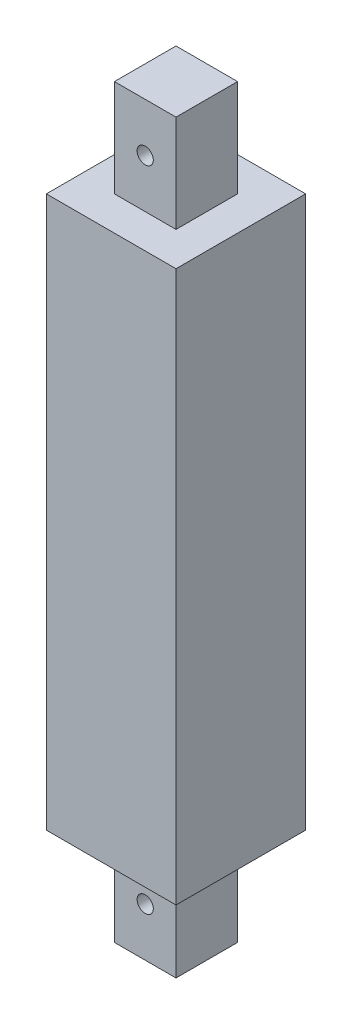
ISO-10303-21;
HEADER;
FILE_DESCRIPTION(('STEP AP214'),'2;1');
FILE_NAME('part.step','',(''),(''),'','','');
FILE_SCHEMA(('AUTOMOTIVE_DESIGN { 1 0 10303 214 1 1 1 1 }'));
ENDSEC;
DATA;
#1=APPLICATION_CONTEXT('core data for automotive mechanical design processes');
#2=APPLICATION_PROTOCOL_DEFINITION('international standard','automotive_design',2000,#1);
#3=PRODUCT_CONTEXT('',#1,'mechanical');
#4=PRODUCT('Part','Part','',(#3));
#5=PRODUCT_RELATED_PRODUCT_CATEGORY('part','',(#4));
#6=PRODUCT_DEFINITION_FORMATION('','',#4);
#7=PRODUCT_DEFINITION_CONTEXT('part definition',#1,'design');
#8=PRODUCT_DEFINITION('design','',#6,#7);
#9=PRODUCT_DEFINITION_SHAPE('','',#8);
#10=(LENGTH_UNIT() NAMED_UNIT(*) SI_UNIT(.MILLI.,.METRE.));
#11=(NAMED_UNIT(*) PLANE_ANGLE_UNIT() SI_UNIT($,.RADIAN.));
#12=(NAMED_UNIT(*) SI_UNIT($,.STERADIAN.) SOLID_ANGLE_UNIT());
#13=UNCERTAINTY_MEASURE_WITH_UNIT(LENGTH_MEASURE(1.E-05),#10,'distance_accuracy_value','');
#14=(GEOMETRIC_REPRESENTATION_CONTEXT(3) GLOBAL_UNCERTAINTY_ASSIGNED_CONTEXT((#13)) GLOBAL_UNIT_ASSIGNED_CONTEXT((#10,
#11,#12)) REPRESENTATION_CONTEXT('',''));
#15=CARTESIAN_POINT('',(0.,0.,0.));
#16=DIRECTION('',(0.,0.,1.));
#17=DIRECTION('',(1.,0.,0.));
#18=AXIS2_PLACEMENT_3D('',#15,#16,#17);
#19=CARTESIAN_POINT('',(0.,0.,0.));
#20=DIRECTION('',(0.,1.,0.));
#21=DIRECTION('',(0.,0.,1.));
#22=AXIS2_PLACEMENT_3D('',#19,#20,#21);
#23=PLANE('',#22);
#24=DIRECTION('',(0.,0.,-1.));
#25=VECTOR('',#24,1.);
#26=CARTESIAN_POINT('',(20.,0.,-20.));
#27=LINE('',#26,#25);
#28=CARTESIAN_POINT('',(20.,0.,20.));
#29=VERTEX_POINT('',#28);
#30=CARTESIAN_POINT('',(20.,0.,-20.));
#31=VERTEX_POINT('',#30);
#32=EDGE_CURVE('E209',#29,#31,#27,.T.);
#33=ORIENTED_EDGE('',*,*,#32,.F.);
#34=DIRECTION('',(1.,0.,0.));
#35=VECTOR('',#34,1.);
#36=CARTESIAN_POINT('',(-20.,0.,20.));
#37=LINE('',#36,#35);
#38=CARTESIAN_POINT('',(-20.,0.,20.));
#39=VERTEX_POINT('',#38);
#40=EDGE_CURVE('E215',#39,#29,#37,.T.);
#41=ORIENTED_EDGE('',*,*,#40,.F.);
#42=DIRECTION('',(0.,0.,1.));
#43=VECTOR('',#42,1.);
#44=CARTESIAN_POINT('',(-20.,0.,-20.));
#45=LINE('',#44,#43);
#46=CARTESIAN_POINT('',(-20.,0.,-20.));
#47=VERTEX_POINT('',#46);
#48=EDGE_CURVE('E231',#47,#39,#45,.T.);
#49=ORIENTED_EDGE('',*,*,#48,.F.);
#50=DIRECTION('',(-1.,0.,0.));
#51=VECTOR('',#50,1.);
#52=CARTESIAN_POINT('',(-20.,0.,-20.));
#53=LINE('',#52,#51);
#54=EDGE_CURVE('E228',#31,#47,#53,.T.);
#55=ORIENTED_EDGE('',*,*,#54,.F.);
#56=EDGE_LOOP('',(#33,#41,#49,#55));
#57=FACE_BOUND('',#56,.T.);
#58=DIRECTION('',(0.,0.,1.));
#59=VECTOR('',#58,1.);
#60=CARTESIAN_POINT('',(9.5,0.,9.5));
#61=LINE('',#60,#59);
#62=CARTESIAN_POINT('',(9.5,0.,-9.5));
#63=VERTEX_POINT('',#62);
#64=CARTESIAN_POINT('',(9.5,0.,9.5));
#65=VERTEX_POINT('',#64);
#66=EDGE_CURVE('E61',#63,#65,#61,.T.);
#67=ORIENTED_EDGE('',*,*,#66,.F.);
#68=DIRECTION('',(1.,0.,0.));
#69=VECTOR('',#68,1.);
#70=CARTESIAN_POINT('',(-9.5,0.,-9.5));
#71=LINE('',#70,#69);
#72=CARTESIAN_POINT('',(-9.5,0.,-9.5));
#73=VERTEX_POINT('',#72);
#74=EDGE_CURVE('E65',#73,#63,#71,.T.);
#75=ORIENTED_EDGE('',*,*,#74,.F.);
#76=DIRECTION('',(0.,0.,-1.));
#77=VECTOR('',#76,1.);
#78=CARTESIAN_POINT('',(-9.5,0.,9.5));
#79=LINE('',#78,#77);
#80=CARTESIAN_POINT('',(-9.5,0.,9.5));
#81=VERTEX_POINT('',#80);
#82=EDGE_CURVE('E370',#81,#73,#79,.T.);
#83=ORIENTED_EDGE('',*,*,#82,.F.);
#84=DIRECTION('',(-1.,0.,0.));
#85=VECTOR('',#84,1.);
#86=CARTESIAN_POINT('',(-9.5,0.,9.5));
#87=LINE('',#86,#85);
#88=EDGE_CURVE('E367',#65,#81,#87,.T.);
#89=ORIENTED_EDGE('',*,*,#88,.F.);
#90=EDGE_LOOP('',(#67,#75,#83,#89));
#91=FACE_BOUND('',#90,.T.);
#92=ADVANCED_FACE('F45',(#57,#91),#23,.F.);
#93=CARTESIAN_POINT('',(20.,170.,-20.));
#94=DIRECTION('',(-1.,0.,0.));
#95=DIRECTION('',(0.,0.,1.));
#96=AXIS2_PLACEMENT_3D('',#93,#94,#95);
#97=PLANE('',#96);
#98=ORIENTED_EDGE('',*,*,#32,.T.);
#99=DIRECTION('',(0.,-1.,0.));
#100=VECTOR('',#99,1.);
#101=CARTESIAN_POINT('',(20.,170.,-20.));
#102=LINE('',#101,#100);
#103=CARTESIAN_POINT('',(20.,170.,-20.));
#104=VERTEX_POINT('',#103);
#105=EDGE_CURVE('E11',#104,#31,#102,.T.);
#106=ORIENTED_EDGE('',*,*,#105,.F.);
#107=DIRECTION('',(0.,0.,-1.));
#108=VECTOR('',#107,1.);
#109=CARTESIAN_POINT('',(20.,170.,-20.));
#110=LINE('',#109,#108);
#111=CARTESIAN_POINT('',(20.,170.,20.));
#112=VERTEX_POINT('',#111);
#113=EDGE_CURVE('E210',#112,#104,#110,.T.);
#114=ORIENTED_EDGE('',*,*,#113,.F.);
#115=DIRECTION('',(0.,-1.,0.));
#116=VECTOR('',#115,1.);
#117=CARTESIAN_POINT('',(20.,170.,20.));
#118=LINE('',#117,#116);
#119=EDGE_CURVE('E224',#112,#29,#118,.T.);
#120=ORIENTED_EDGE('',*,*,#119,.T.);
#121=EDGE_LOOP('',(#98,#106,#114,#120));
#122=FACE_BOUND('',#121,.T.);
#123=ADVANCED_FACE('F47',(#122),#97,.F.);
#124=CARTESIAN_POINT('',(-20.,170.,-20.));
#125=DIRECTION('',(0.,0.,1.));
#126=DIRECTION('',(1.,0.,0.));
#127=AXIS2_PLACEMENT_3D('',#124,#125,#126);
#128=PLANE('',#127);
#129=ORIENTED_EDGE('',*,*,#54,.T.);
#130=DIRECTION('',(0.,-1.,0.));
#131=VECTOR('',#130,1.);
#132=CARTESIAN_POINT('',(-20.,170.,-20.));
#133=LINE('',#132,#131);
#134=CARTESIAN_POINT('',(-20.,170.,-20.));
#135=VERTEX_POINT('',#134);
#136=EDGE_CURVE('E54',#135,#47,#133,.T.);
#137=ORIENTED_EDGE('',*,*,#136,.F.);
#138=DIRECTION('',(-1.,0.,0.));
#139=VECTOR('',#138,1.);
#140=CARTESIAN_POINT('',(-20.,170.,-20.));
#141=LINE('',#140,#139);
#142=EDGE_CURVE('E214',#104,#135,#141,.T.);
#143=ORIENTED_EDGE('',*,*,#142,.F.);
#144=ORIENTED_EDGE('',*,*,#105,.T.);
#145=EDGE_LOOP('',(#129,#137,#143,#144));
#146=FACE_BOUND('',#145,.T.);
#147=ADVANCED_FACE('F263',(#146),#128,.F.);
#148=CARTESIAN_POINT('',(-20.,170.,-20.));
#149=DIRECTION('',(1.,0.,0.));
#150=DIRECTION('',(0.,0.,-1.));
#151=AXIS2_PLACEMENT_3D('',#148,#149,#150);
#152=PLANE('',#151);
#153=ORIENTED_EDGE('',*,*,#48,.T.);
#154=DIRECTION('',(0.,-1.,0.));
#155=VECTOR('',#154,1.);
#156=CARTESIAN_POINT('',(-20.,170.,20.));
#157=LINE('',#156,#155);
#158=CARTESIAN_POINT('',(-20.,170.,20.));
#159=VERTEX_POINT('',#158);
#160=EDGE_CURVE('E239',#159,#39,#157,.T.);
#161=ORIENTED_EDGE('',*,*,#160,.F.);
#162=DIRECTION('',(0.,0.,1.));
#163=VECTOR('',#162,1.);
#164=CARTESIAN_POINT('',(-20.,170.,-20.));
#165=LINE('',#164,#163);
#166=EDGE_CURVE('E218',#135,#159,#165,.T.);
#167=ORIENTED_EDGE('',*,*,#166,.F.);
#168=ORIENTED_EDGE('',*,*,#136,.T.);
#169=EDGE_LOOP('',(#153,#161,#167,#168));
#170=FACE_BOUND('',#169,.T.);
#171=ADVANCED_FACE('F248',(#170),#152,.F.);
#172=CARTESIAN_POINT('',(-20.,170.,20.));
#173=DIRECTION('',(0.,0.,-1.));
#174=DIRECTION('',(-1.,0.,0.));
#175=AXIS2_PLACEMENT_3D('',#172,#173,#174);
#176=PLANE('',#175);
#177=ORIENTED_EDGE('',*,*,#40,.T.);
#178=ORIENTED_EDGE('',*,*,#119,.F.);
#179=DIRECTION('',(1.,0.,0.));
#180=VECTOR('',#179,1.);
#181=CARTESIAN_POINT('',(-20.,170.,20.));
#182=LINE('',#181,#180);
#183=EDGE_CURVE('E221',#159,#112,#182,.T.);
#184=ORIENTED_EDGE('',*,*,#183,.F.);
#185=ORIENTED_EDGE('',*,*,#160,.T.);
#186=EDGE_LOOP('',(#177,#178,#184,#185));
#187=FACE_BOUND('',#186,.T.);
#188=ADVANCED_FACE('F256',(#187),#176,.F.);
#189=CARTESIAN_POINT('',(0.,170.,0.));
#190=DIRECTION('',(0.,1.,0.));
#191=DIRECTION('',(0.,0.,1.));
#192=AXIS2_PLACEMENT_3D('',#189,#190,#191);
#193=PLANE('',#192);
#194=DIRECTION('',(0.,0.,-1.));
#195=VECTOR('',#194,1.);
#196=CARTESIAN_POINT('',(9.5,170.,-9.5));
#197=LINE('',#196,#195);
#198=CARTESIAN_POINT('',(9.5,170.,9.5));
#199=VERTEX_POINT('',#198);
#200=CARTESIAN_POINT('',(9.5,170.,-9.5));
#201=VERTEX_POINT('',#200);
#202=EDGE_CURVE('E158',#199,#201,#197,.T.);
#203=ORIENTED_EDGE('',*,*,#202,.F.);
#204=DIRECTION('',(1.,0.,0.));
#205=VECTOR('',#204,1.);
#206=CARTESIAN_POINT('',(-9.5,170.,9.5));
#207=LINE('',#206,#205);
#208=CARTESIAN_POINT('',(-9.5,170.,9.5));
#209=VERTEX_POINT('',#208);
#210=EDGE_CURVE('E174',#209,#199,#207,.T.);
#211=ORIENTED_EDGE('',*,*,#210,.F.);
#212=DIRECTION('',(0.,0.,1.));
#213=VECTOR('',#212,1.);
#214=CARTESIAN_POINT('',(-9.5,170.,-9.5));
#215=LINE('',#214,#213);
#216=CARTESIAN_POINT('',(-9.5,170.,-9.5));
#217=VERTEX_POINT('',#216);
#218=EDGE_CURVE('E187',#217,#209,#215,.T.);
#219=ORIENTED_EDGE('',*,*,#218,.F.);
#220=DIRECTION('',(-1.,0.,0.));
#221=VECTOR('',#220,1.);
#222=CARTESIAN_POINT('',(-9.5,170.,-9.5));
#223=LINE('',#222,#221);
#224=EDGE_CURVE('E163',#201,#217,#223,.T.);
#225=ORIENTED_EDGE('',*,*,#224,.F.);
#226=EDGE_LOOP('',(#203,#211,#219,#225));
#227=FACE_BOUND('',#226,.T.);
#228=ORIENTED_EDGE('',*,*,#113,.T.);
#229=ORIENTED_EDGE('',*,*,#142,.T.);
#230=ORIENTED_EDGE('',*,*,#166,.T.);
#231=ORIENTED_EDGE('',*,*,#183,.T.);
#232=EDGE_LOOP('',(#228,#229,#230,#231));
#233=FACE_BOUND('',#232,.T.);
#234=ADVANCED_FACE('F262',(#227,#233),#193,.T.);
#235=CARTESIAN_POINT('',(9.5,200.,-9.5));
#236=DIRECTION('',(-1.,0.,0.));
#237=DIRECTION('',(0.,0.,1.));
#238=AXIS2_PLACEMENT_3D('',#235,#236,#237);
#239=PLANE('',#238);
#240=ORIENTED_EDGE('',*,*,#202,.T.);
#241=DIRECTION('',(0.,-1.,0.));
#242=VECTOR('',#241,1.);
#243=CARTESIAN_POINT('',(9.5,200.,-9.5));
#244=LINE('',#243,#242);
#245=CARTESIAN_POINT('',(9.5,200.,-9.5));
#246=VERTEX_POINT('',#245);
#247=EDGE_CURVE('E205',#246,#201,#244,.T.);
#248=ORIENTED_EDGE('',*,*,#247,.F.);
#249=DIRECTION('',(0.,0.,-1.));
#250=VECTOR('',#249,1.);
#251=CARTESIAN_POINT('',(9.5,200.,-9.5));
#252=LINE('',#251,#250);
#253=CARTESIAN_POINT('',(9.5,200.,9.5));
#254=VERTEX_POINT('',#253);
#255=EDGE_CURVE('E169',#254,#246,#252,.T.);
#256=ORIENTED_EDGE('',*,*,#255,.F.);
#257=DIRECTION('',(0.,-1.,0.));
#258=VECTOR('',#257,1.);
#259=CARTESIAN_POINT('',(9.5,200.,9.5));
#260=LINE('',#259,#258);
#261=EDGE_CURVE('E182',#254,#199,#260,.T.);
#262=ORIENTED_EDGE('',*,*,#261,.T.);
#263=EDGE_LOOP('',(#240,#248,#256,#262));
#264=FACE_BOUND('',#263,.T.);
#265=ADVANCED_FACE('F281',(#264),#239,.F.);
#266=CARTESIAN_POINT('',(-9.5,200.,-9.5));
#267=DIRECTION('',(0.,0.,1.));
#268=DIRECTION('',(1.,0.,0.));
#269=AXIS2_PLACEMENT_3D('',#266,#267,#268);
#270=PLANE('',#269);
#271=CARTESIAN_POINT('',(0.,185.,-9.5));
#272=DIRECTION('',(0.,0.,-1.));
#273=DIRECTION('',(-1.,0.,0.));
#274=AXIS2_PLACEMENT_3D('',#271,#272,#273);
#275=CIRCLE('',#274,2.5);
#276=CARTESIAN_POINT('',(-2.5,185.,-9.5));
#277=VERTEX_POINT('',#276);
#278=EDGE_CURVE('E348',#277,#277,#275,.T.);
#279=ORIENTED_EDGE('',*,*,#278,.F.);
#280=EDGE_LOOP('',(#279));
#281=FACE_BOUND('',#280,.T.);
#282=ORIENTED_EDGE('',*,*,#224,.T.);
#283=DIRECTION('',(0.,-1.,0.));
#284=VECTOR('',#283,1.);
#285=CARTESIAN_POINT('',(-9.5,200.,-9.5));
#286=LINE('',#285,#284);
#287=CARTESIAN_POINT('',(-9.5,200.,-9.5));
#288=VERTEX_POINT('',#287);
#289=EDGE_CURVE('E201',#288,#217,#286,.T.);
#290=ORIENTED_EDGE('',*,*,#289,.F.);
#291=DIRECTION('',(-1.,0.,0.));
#292=VECTOR('',#291,1.);
#293=CARTESIAN_POINT('',(-9.5,200.,-9.5));
#294=LINE('',#293,#292);
#295=EDGE_CURVE('E173',#246,#288,#294,.T.);
#296=ORIENTED_EDGE('',*,*,#295,.F.);
#297=ORIENTED_EDGE('',*,*,#247,.T.);
#298=EDGE_LOOP('',(#282,#290,#296,#297));
#299=FACE_BOUND('',#298,.T.);
#300=ADVANCED_FACE('F286',(#281,#299),#270,.F.);
#301=CARTESIAN_POINT('',(-9.5,200.,-9.5));
#302=DIRECTION('',(1.,0.,0.));
#303=DIRECTION('',(0.,0.,-1.));
#304=AXIS2_PLACEMENT_3D('',#301,#302,#303);
#305=PLANE('',#304);
#306=ORIENTED_EDGE('',*,*,#218,.T.);
#307=DIRECTION('',(0.,-1.,0.));
#308=VECTOR('',#307,1.);
#309=CARTESIAN_POINT('',(-9.5,200.,9.5));
#310=LINE('',#309,#308);
#311=CARTESIAN_POINT('',(-9.5,200.,9.5));
#312=VERTEX_POINT('',#311);
#313=EDGE_CURVE('E197',#312,#209,#310,.T.);
#314=ORIENTED_EDGE('',*,*,#313,.F.);
#315=DIRECTION('',(0.,0.,1.));
#316=VECTOR('',#315,1.);
#317=CARTESIAN_POINT('',(-9.5,200.,-9.5));
#318=LINE('',#317,#316);
#319=EDGE_CURVE('E177',#288,#312,#318,.T.);
#320=ORIENTED_EDGE('',*,*,#319,.F.);
#321=ORIENTED_EDGE('',*,*,#289,.T.);
#322=EDGE_LOOP('',(#306,#314,#320,#321));
#323=FACE_BOUND('',#322,.T.);
#324=ADVANCED_FACE('F300',(#323),#305,.F.);
#325=CARTESIAN_POINT('',(-9.5,200.,9.5));
#326=DIRECTION('',(0.,0.,-1.));
#327=DIRECTION('',(-1.,0.,0.));
#328=AXIS2_PLACEMENT_3D('',#325,#326,#327);
#329=PLANE('',#328);
#330=CARTESIAN_POINT('',(0.,185.,9.5));
#331=DIRECTION('',(0.,0.,-1.));
#332=DIRECTION('',(-1.,0.,0.));
#333=AXIS2_PLACEMENT_3D('',#330,#331,#332);
#334=CIRCLE('',#333,2.5);
#335=CARTESIAN_POINT('',(-2.5,185.,9.5));
#336=VERTEX_POINT('',#335);
#337=EDGE_CURVE('E354',#336,#336,#334,.T.);
#338=ORIENTED_EDGE('',*,*,#337,.T.);
#339=EDGE_LOOP('',(#338));
#340=FACE_BOUND('',#339,.T.);
#341=ORIENTED_EDGE('',*,*,#210,.T.);
#342=ORIENTED_EDGE('',*,*,#261,.F.);
#343=DIRECTION('',(1.,0.,0.));
#344=VECTOR('',#343,1.);
#345=CARTESIAN_POINT('',(-9.5,200.,9.5));
#346=LINE('',#345,#344);
#347=EDGE_CURVE('E180',#312,#254,#346,.T.);
#348=ORIENTED_EDGE('',*,*,#347,.F.);
#349=ORIENTED_EDGE('',*,*,#313,.T.);
#350=EDGE_LOOP('',(#341,#342,#348,#349));
#351=FACE_BOUND('',#350,.T.);
#352=ADVANCED_FACE('F291',(#340,#351),#329,.F.);
#353=CARTESIAN_POINT('',(0.,200.,0.));
#354=DIRECTION('',(0.,1.,0.));
#355=DIRECTION('',(0.,0.,1.));
#356=AXIS2_PLACEMENT_3D('',#353,#354,#355);
#357=PLANE('',#356);
#358=ORIENTED_EDGE('',*,*,#255,.T.);
#359=ORIENTED_EDGE('',*,*,#295,.T.);
#360=ORIENTED_EDGE('',*,*,#319,.T.);
#361=ORIENTED_EDGE('',*,*,#347,.T.);
#362=EDGE_LOOP('',(#358,#359,#360,#361));
#363=FACE_BOUND('',#362,.T.);
#364=ADVANCED_FACE('F296',(#363),#357,.T.);
#365=CARTESIAN_POINT('',(9.5,-30.,9.5));
#366=DIRECTION('',(-1.,0.,0.));
#367=DIRECTION('',(0.,0.,1.));
#368=AXIS2_PLACEMENT_3D('',#365,#366,#367);
#369=PLANE('',#368);
#370=ORIENTED_EDGE('',*,*,#66,.T.);
#371=DIRECTION('',(0.,1.,0.));
#372=VECTOR('',#371,1.);
#373=CARTESIAN_POINT('',(9.5,-30.,9.5));
#374=LINE('',#373,#372);
#375=CARTESIAN_POINT('',(9.5,-30.,9.5));
#376=VERTEX_POINT('',#375);
#377=EDGE_CURVE('E138',#376,#65,#374,.T.);
#378=ORIENTED_EDGE('',*,*,#377,.F.);
#379=DIRECTION('',(0.,0.,1.));
#380=VECTOR('',#379,1.);
#381=CARTESIAN_POINT('',(9.5,-30.,9.5));
#382=LINE('',#381,#380);
#383=CARTESIAN_POINT('',(9.5,-30.,-9.5));
#384=VERTEX_POINT('',#383);
#385=EDGE_CURVE('E145',#384,#376,#382,.T.);
#386=ORIENTED_EDGE('',*,*,#385,.F.);
#387=DIRECTION('',(0.,1.,0.));
#388=VECTOR('',#387,1.);
#389=CARTESIAN_POINT('',(9.5,-30.,-9.5));
#390=LINE('',#389,#388);
#391=EDGE_CURVE('E364',#384,#63,#390,.T.);
#392=ORIENTED_EDGE('',*,*,#391,.T.);
#393=EDGE_LOOP('',(#370,#378,#386,#392));
#394=FACE_BOUND('',#393,.T.);
#395=ADVANCED_FACE('F156',(#394),#369,.F.);
#396=CARTESIAN_POINT('',(-9.5,-30.,9.5));
#397=DIRECTION('',(0.,0.,-1.));
#398=DIRECTION('',(-1.,0.,0.));
#399=AXIS2_PLACEMENT_3D('',#396,#397,#398);
#400=PLANE('',#399);
#401=CARTESIAN_POINT('',(0.,-15.,9.5));
#402=DIRECTION('',(0.,0.,-1.));
#403=DIRECTION('',(-1.,0.,0.));
#404=AXIS2_PLACEMENT_3D('',#401,#402,#403);
#405=CIRCLE('',#404,2.5);
#406=CARTESIAN_POINT('',(-2.5,-15.,9.5));
#407=VERTEX_POINT('',#406);
#408=EDGE_CURVE('E343',#407,#407,#405,.T.);
#409=ORIENTED_EDGE('',*,*,#408,.T.);
#410=EDGE_LOOP('',(#409));
#411=FACE_BOUND('',#410,.T.);
#412=ORIENTED_EDGE('',*,*,#88,.T.);
#413=DIRECTION('',(0.,1.,0.));
#414=VECTOR('',#413,1.);
#415=CARTESIAN_POINT('',(-9.5,-30.,9.5));
#416=LINE('',#415,#414);
#417=CARTESIAN_POINT('',(-9.5,-30.,9.5));
#418=VERTEX_POINT('',#417);
#419=EDGE_CURVE('E140',#418,#81,#416,.T.);
#420=ORIENTED_EDGE('',*,*,#419,.F.);
#421=DIRECTION('',(-1.,0.,0.));
#422=VECTOR('',#421,1.);
#423=CARTESIAN_POINT('',(-9.5,-30.,9.5));
#424=LINE('',#423,#422);
#425=EDGE_CURVE('E133',#376,#418,#424,.T.);
#426=ORIENTED_EDGE('',*,*,#425,.F.);
#427=ORIENTED_EDGE('',*,*,#377,.T.);
#428=EDGE_LOOP('',(#412,#420,#426,#427));
#429=FACE_BOUND('',#428,.T.);
#430=ADVANCED_FACE('F136',(#411,#429),#400,.F.);
#431=CARTESIAN_POINT('',(-9.5,-30.,9.5));
#432=DIRECTION('',(1.,0.,0.));
#433=DIRECTION('',(0.,0.,-1.));
#434=AXIS2_PLACEMENT_3D('',#431,#432,#433);
#435=PLANE('',#434);
#436=ORIENTED_EDGE('',*,*,#82,.T.);
#437=DIRECTION('',(0.,1.,0.));
#438=VECTOR('',#437,1.);
#439=CARTESIAN_POINT('',(-9.5,-30.,-9.5));
#440=LINE('',#439,#438);
#441=CARTESIAN_POINT('',(-9.5,-30.,-9.5));
#442=VERTEX_POINT('',#441);
#443=EDGE_CURVE('E165',#442,#73,#440,.T.);
#444=ORIENTED_EDGE('',*,*,#443,.F.);
#445=DIRECTION('',(0.,0.,-1.));
#446=VECTOR('',#445,1.);
#447=CARTESIAN_POINT('',(-9.5,-30.,9.5));
#448=LINE('',#447,#446);
#449=EDGE_CURVE('E144',#418,#442,#448,.T.);
#450=ORIENTED_EDGE('',*,*,#449,.F.);
#451=ORIENTED_EDGE('',*,*,#419,.T.);
#452=EDGE_LOOP('',(#436,#444,#450,#451));
#453=FACE_BOUND('',#452,.T.);
#454=ADVANCED_FACE('F320',(#453),#435,.F.);
#455=CARTESIAN_POINT('',(-9.5,-30.,-9.5));
#456=DIRECTION('',(0.,0.,1.));
#457=DIRECTION('',(1.,0.,0.));
#458=AXIS2_PLACEMENT_3D('',#455,#456,#457);
#459=PLANE('',#458);
#460=CARTESIAN_POINT('',(0.,-15.,-9.5));
#461=DIRECTION('',(0.,0.,-1.));
#462=DIRECTION('',(-1.,0.,0.));
#463=AXIS2_PLACEMENT_3D('',#460,#461,#462);
#464=CIRCLE('',#463,2.5);
#465=CARTESIAN_POINT('',(-2.5,-15.,-9.5));
#466=VERTEX_POINT('',#465);
#467=EDGE_CURVE('E346',#466,#466,#464,.T.);
#468=ORIENTED_EDGE('',*,*,#467,.F.);
#469=EDGE_LOOP('',(#468));
#470=FACE_BOUND('',#469,.T.);
#471=ORIENTED_EDGE('',*,*,#74,.T.);
#472=ORIENTED_EDGE('',*,*,#391,.F.);
#473=DIRECTION('',(1.,0.,0.));
#474=VECTOR('',#473,1.);
#475=CARTESIAN_POINT('',(-9.5,-30.,-9.5));
#476=LINE('',#475,#474);
#477=EDGE_CURVE('E150',#442,#384,#476,.T.);
#478=ORIENTED_EDGE('',*,*,#477,.F.);
#479=ORIENTED_EDGE('',*,*,#443,.T.);
#480=EDGE_LOOP('',(#471,#472,#478,#479));
#481=FACE_BOUND('',#480,.T.);
#482=ADVANCED_FACE('F324',(#470,#481),#459,.F.);
#483=CARTESIAN_POINT('',(0.,-30.,0.));
#484=DIRECTION('',(0.,-1.,0.));
#485=DIRECTION('',(0.,0.,-1.));
#486=AXIS2_PLACEMENT_3D('',#483,#484,#485);
#487=PLANE('',#486);
#488=ORIENTED_EDGE('',*,*,#385,.T.);
#489=ORIENTED_EDGE('',*,*,#425,.T.);
#490=ORIENTED_EDGE('',*,*,#449,.T.);
#491=ORIENTED_EDGE('',*,*,#477,.T.);
#492=EDGE_LOOP('',(#488,#489,#490,#491));
#493=FACE_BOUND('',#492,.T.);
#494=ADVANCED_FACE('F148',(#493),#487,.T.);
#495=CARTESIAN_POINT('',(0.,-15.,9.5));
#496=DIRECTION('',(0.,0.,-1.));
#497=DIRECTION('',(-1.,0.,0.));
#498=AXIS2_PLACEMENT_3D('',#495,#496,#497);
#499=CYLINDRICAL_SURFACE('',#498,2.5);
#500=ORIENTED_EDGE('',*,*,#408,.F.);
#501=EDGE_LOOP('',(#500));
#502=FACE_BOUND('',#501,.T.);
#503=ORIENTED_EDGE('',*,*,#467,.T.);
#504=EDGE_LOOP('',(#503));
#505=FACE_BOUND('',#504,.T.);
#506=ADVANCED_FACE('F331',(#502,#505),#499,.F.);
#507=CARTESIAN_POINT('',(0.,185.,9.5));
#508=DIRECTION('',(0.,0.,-1.));
#509=DIRECTION('',(-1.,0.,0.));
#510=AXIS2_PLACEMENT_3D('',#507,#508,#509);
#511=CYLINDRICAL_SURFACE('',#510,2.5);
#512=ORIENTED_EDGE('',*,*,#337,.F.);
#513=EDGE_LOOP('',(#512));
#514=FACE_BOUND('',#513,.T.);
#515=ORIENTED_EDGE('',*,*,#278,.T.);
#516=EDGE_LOOP('',(#515));
#517=FACE_BOUND('',#516,.T.);
#518=ADVANCED_FACE('F332',(#514,#517),#511,.F.);
#519=CLOSED_SHELL('',(#92,#123,#147,#171,#188,#234,#265,#300,#324,#352,#364,#395,#430,#454,#482,
#494,#506,#518));
#520=MANIFOLD_SOLID_BREP('B2',#519);
#521=ADVANCED_BREP_SHAPE_REPRESENTATION('',(#18,#520),#14);
#522=SHAPE_DEFINITION_REPRESENTATION(#9,#521);
ENDSEC;
END-ISO-10303-21;
